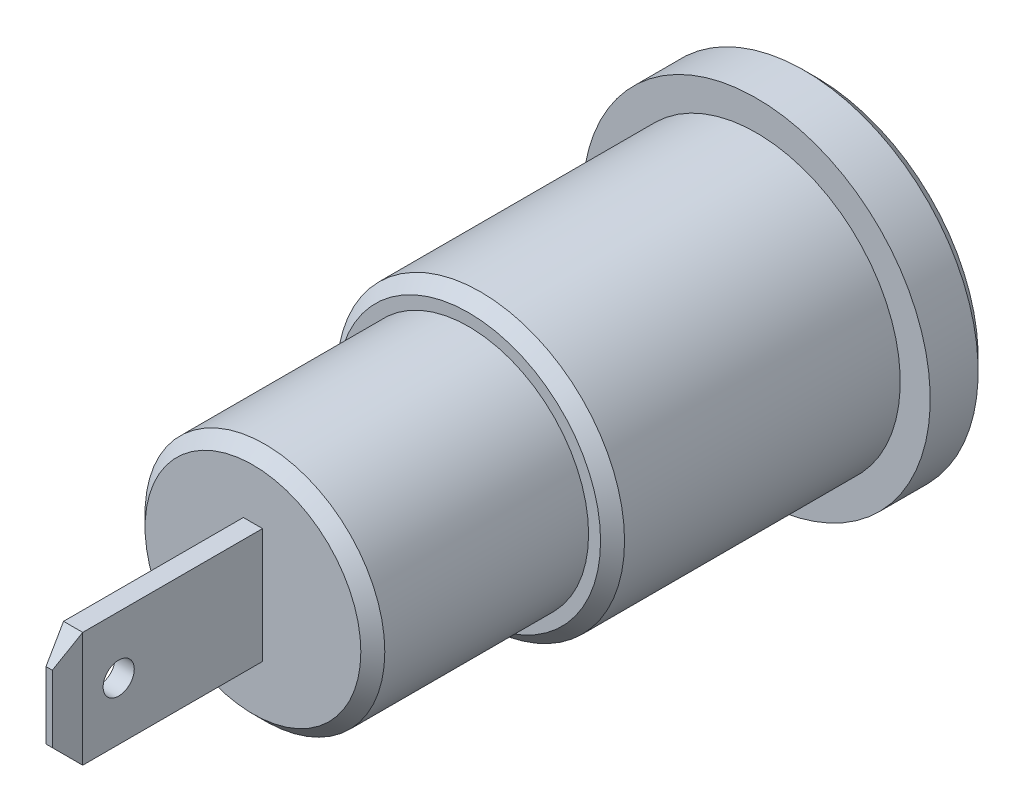
ISO-10303-21;
HEADER;
FILE_DESCRIPTION(('STEP AP214'),'2;1');
FILE_NAME('part.step','',(''),(''),'','','');
FILE_SCHEMA(('AUTOMOTIVE_DESIGN { 1 0 10303 214 1 1 1 1 }'));
ENDSEC;
DATA;
#1=APPLICATION_CONTEXT('core data for automotive mechanical design processes');
#2=APPLICATION_PROTOCOL_DEFINITION('international standard','automotive_design',2000,#1);
#3=PRODUCT_CONTEXT('',#1,'mechanical');
#4=PRODUCT('Part','Part','',(#3));
#5=PRODUCT_RELATED_PRODUCT_CATEGORY('part','',(#4));
#6=PRODUCT_DEFINITION_FORMATION('','',#4);
#7=PRODUCT_DEFINITION_CONTEXT('part definition',#1,'design');
#8=PRODUCT_DEFINITION('design','',#6,#7);
#9=PRODUCT_DEFINITION_SHAPE('','',#8);
#10=(LENGTH_UNIT() NAMED_UNIT(*) SI_UNIT(.MILLI.,.METRE.));
#11=(NAMED_UNIT(*) PLANE_ANGLE_UNIT() SI_UNIT($,.RADIAN.));
#12=(NAMED_UNIT(*) SI_UNIT($,.STERADIAN.) SOLID_ANGLE_UNIT());
#13=UNCERTAINTY_MEASURE_WITH_UNIT(LENGTH_MEASURE(1.E-05),#10,'distance_accuracy_value','');
#14=(GEOMETRIC_REPRESENTATION_CONTEXT(3) GLOBAL_UNCERTAINTY_ASSIGNED_CONTEXT((#13)) GLOBAL_UNIT_ASSIGNED_CONTEXT((#10,
#11,#12)) REPRESENTATION_CONTEXT('',''));
#15=CARTESIAN_POINT('',(0.,0.,0.));
#16=DIRECTION('',(0.,0.,1.));
#17=DIRECTION('',(1.,0.,0.));
#18=AXIS2_PLACEMENT_3D('',#15,#16,#17);
#19=CARTESIAN_POINT('',(0.,0.,21.));
#20=DIRECTION('',(0.,0.,1.));
#21=DIRECTION('',(1.,0.,0.));
#22=AXIS2_PLACEMENT_3D('',#19,#20,#21);
#23=PLANE('',#22);
#24=CARTESIAN_POINT('',(0.,0.,21.));
#25=DIRECTION('',(0.,0.,1.));
#26=DIRECTION('',(1.,0.,0.));
#27=AXIS2_PLACEMENT_3D('',#24,#25,#26);
#28=CIRCLE('',#27,4.5);
#29=CARTESIAN_POINT('',(4.5,0.,21.));
#30=VERTEX_POINT('',#29);
#31=EDGE_CURVE('E170',#30,#30,#28,.T.);
#32=ORIENTED_EDGE('',*,*,#31,.T.);
#33=EDGE_LOOP('',(#32));
#34=FACE_BOUND('',#33,.T.);
#35=DIRECTION('',(1.,0.,0.));
#36=VECTOR('',#35,1.);
#37=CARTESIAN_POINT('',(-0.4,-2.4,21.));
#38=LINE('',#37,#36);
#39=CARTESIAN_POINT('',(-0.4,-2.4,21.));
#40=VERTEX_POINT('',#39);
#41=CARTESIAN_POINT('',(0.4,-2.4,21.));
#42=VERTEX_POINT('',#41);
#43=EDGE_CURVE('E132',#40,#42,#38,.T.);
#44=ORIENTED_EDGE('',*,*,#43,.F.);
#45=DIRECTION('',(0.,1.,0.));
#46=VECTOR('',#45,1.);
#47=CARTESIAN_POINT('',(-0.4,-2.4,21.));
#48=LINE('',#47,#46);
#49=CARTESIAN_POINT('',(-0.4,2.4,21.));
#50=VERTEX_POINT('',#49);
#51=EDGE_CURVE('E98',#40,#50,#48,.T.);
#52=ORIENTED_EDGE('',*,*,#51,.T.);
#53=DIRECTION('',(1.,0.,0.));
#54=VECTOR('',#53,1.);
#55=CARTESIAN_POINT('',(-0.4,2.4,21.));
#56=LINE('',#55,#54);
#57=CARTESIAN_POINT('',(0.4,2.4,21.));
#58=VERTEX_POINT('',#57);
#59=EDGE_CURVE('E92',#50,#58,#56,.T.);
#60=ORIENTED_EDGE('',*,*,#59,.T.);
#61=DIRECTION('',(0.,1.,0.));
#62=VECTOR('',#61,1.);
#63=CARTESIAN_POINT('',(0.4,-2.4,21.));
#64=LINE('',#63,#62);
#65=EDGE_CURVE('E95',#42,#58,#64,.T.);
#66=ORIENTED_EDGE('',*,*,#65,.F.);
#67=EDGE_LOOP('',(#44,#52,#60,#66));
#68=FACE_BOUND('',#67,.T.);
#69=ADVANCED_FACE('F40',(#34,#68),#23,.T.);
#70=CARTESIAN_POINT('',(0.,0.,12.));
#71=DIRECTION('',(0.,0.,1.));
#72=DIRECTION('',(1.,0.,0.));
#73=AXIS2_PLACEMENT_3D('',#70,#71,#72);
#74=PLANE('',#73);
#75=CARTESIAN_POINT('',(0.,0.,12.));
#76=DIRECTION('',(0.,0.,1.));
#77=DIRECTION('',(1.,0.,0.));
#78=AXIS2_PLACEMENT_3D('',#75,#76,#77);
#79=CIRCLE('',#78,5.50000000000001);
#80=CARTESIAN_POINT('',(5.50000000000001,0.,12.));
#81=VERTEX_POINT('',#80);
#82=EDGE_CURVE('E193',#81,#81,#79,.T.);
#83=ORIENTED_EDGE('',*,*,#82,.T.);
#84=EDGE_LOOP('',(#83));
#85=FACE_BOUND('',#84,.T.);
#86=CARTESIAN_POINT('',(0.,0.,12.));
#87=DIRECTION('',(0.,0.,1.));
#88=DIRECTION('',(1.,0.,0.));
#89=AXIS2_PLACEMENT_3D('',#86,#87,#88);
#90=CIRCLE('',#89,5.);
#91=CARTESIAN_POINT('',(5.,0.,12.));
#92=VERTEX_POINT('',#91);
#93=EDGE_CURVE('E167',#92,#92,#90,.T.);
#94=ORIENTED_EDGE('',*,*,#93,.F.);
#95=EDGE_LOOP('',(#94));
#96=FACE_BOUND('',#95,.T.);
#97=ADVANCED_FACE('F242',(#85,#96),#74,.T.);
#98=CARTESIAN_POINT('',(0.,0.,12.));
#99=DIRECTION('',(0.,0.,-1.));
#100=DIRECTION('',(-1.,0.,0.));
#101=AXIS2_PLACEMENT_3D('',#98,#99,#100);
#102=CYLINDRICAL_SURFACE('',#101,6.);
#103=CARTESIAN_POINT('',(0.,0.,11.5));
#104=DIRECTION('',(0.,0.,1.));
#105=DIRECTION('',(1.,0.,0.));
#106=AXIS2_PLACEMENT_3D('',#103,#104,#105);
#107=CIRCLE('',#106,6.);
#108=CARTESIAN_POINT('',(6.,0.,11.5));
#109=VERTEX_POINT('',#108);
#110=EDGE_CURVE('E196',#109,#109,#107,.F.);
#111=ORIENTED_EDGE('',*,*,#110,.T.);
#112=EDGE_LOOP('',(#111));
#113=FACE_BOUND('',#112,.T.);
#114=CARTESIAN_POINT('',(0.,0.,0.));
#115=DIRECTION('',(0.,0.,-1.));
#116=DIRECTION('',(-1.,0.,0.));
#117=AXIS2_PLACEMENT_3D('',#114,#115,#116);
#118=CIRCLE('',#117,6.);
#119=CARTESIAN_POINT('',(-6.,0.,0.));
#120=VERTEX_POINT('',#119);
#121=EDGE_CURVE('E164',#120,#120,#118,.T.);
#122=ORIENTED_EDGE('',*,*,#121,.F.);
#123=EDGE_LOOP('',(#122));
#124=FACE_BOUND('',#123,.T.);
#125=ADVANCED_FACE('F248',(#113,#124),#102,.T.);
#126=CARTESIAN_POINT('',(0.,0.,21.));
#127=DIRECTION('',(0.,0.,-1.));
#128=DIRECTION('',(-1.,0.,0.));
#129=AXIS2_PLACEMENT_3D('',#126,#127,#128);
#130=CYLINDRICAL_SURFACE('',#129,5.);
#131=CARTESIAN_POINT('',(0.,0.,20.5));
#132=DIRECTION('',(0.,0.,1.));
#133=DIRECTION('',(1.,0.,0.));
#134=AXIS2_PLACEMENT_3D('',#131,#132,#133);
#135=CIRCLE('',#134,5.);
#136=CARTESIAN_POINT('',(5.,0.,20.5));
#137=VERTEX_POINT('',#136);
#138=EDGE_CURVE('E177',#137,#137,#135,.F.);
#139=ORIENTED_EDGE('',*,*,#138,.T.);
#140=EDGE_LOOP('',(#139));
#141=FACE_BOUND('',#140,.T.);
#142=ORIENTED_EDGE('',*,*,#93,.T.);
#143=EDGE_LOOP('',(#142));
#144=FACE_BOUND('',#143,.T.);
#145=ADVANCED_FACE('F255',(#141,#144),#130,.T.);
#146=CARTESIAN_POINT('',(0.,0.,0.));
#147=DIRECTION('',(0.,0.,-1.));
#148=DIRECTION('',(-1.,0.,0.));
#149=AXIS2_PLACEMENT_3D('',#146,#147,#148);
#150=PLANE('',#149);
#151=CARTESIAN_POINT('',(0.,0.,0.));
#152=DIRECTION('',(0.,0.,-1.));
#153=DIRECTION('',(-1.,0.,0.));
#154=AXIS2_PLACEMENT_3D('',#151,#152,#153);
#155=CIRCLE('',#154,7.25);
#156=CARTESIAN_POINT('',(-7.25,0.,0.));
#157=VERTEX_POINT('',#156);
#158=EDGE_CURVE('E161',#157,#157,#155,.T.);
#159=ORIENTED_EDGE('',*,*,#158,.F.);
#160=EDGE_LOOP('',(#159));
#161=FACE_BOUND('',#160,.T.);
#162=ORIENTED_EDGE('',*,*,#121,.T.);
#163=EDGE_LOOP('',(#162));
#164=FACE_BOUND('',#163,.T.);
#165=ADVANCED_FACE('F257',(#161,#164),#150,.F.);
#166=CARTESIAN_POINT('',(0.,0.,-2.5));
#167=DIRECTION('',(0.,0.,1.));
#168=DIRECTION('',(1.,0.,0.));
#169=AXIS2_PLACEMENT_3D('',#166,#167,#168);
#170=CYLINDRICAL_SURFACE('',#169,7.25);
#171=CARTESIAN_POINT('',(0.,0.,-2.));
#172=DIRECTION('',(0.,0.,-1.));
#173=DIRECTION('',(-1.,0.,0.));
#174=AXIS2_PLACEMENT_3D('',#171,#172,#173);
#175=CIRCLE('',#174,7.25);
#176=CARTESIAN_POINT('',(-7.25,0.,-2.));
#177=VERTEX_POINT('',#176);
#178=EDGE_CURVE('E190',#177,#177,#175,.F.);
#179=ORIENTED_EDGE('',*,*,#178,.T.);
#180=EDGE_LOOP('',(#179));
#181=FACE_BOUND('',#180,.T.);
#182=ORIENTED_EDGE('',*,*,#158,.T.);
#183=EDGE_LOOP('',(#182));
#184=FACE_BOUND('',#183,.T.);
#185=ADVANCED_FACE('F253',(#181,#184),#170,.T.);
#186=CARTESIAN_POINT('',(0.,0.,-2.5));
#187=DIRECTION('',(0.,0.,-1.));
#188=DIRECTION('',(-1.,0.,0.));
#189=AXIS2_PLACEMENT_3D('',#186,#187,#188);
#190=PLANE('',#189);
#191=CARTESIAN_POINT('',(0.,0.,-2.5));
#192=DIRECTION('',(0.,0.,-1.));
#193=DIRECTION('',(-1.,0.,0.));
#194=AXIS2_PLACEMENT_3D('',#191,#192,#193);
#195=CIRCLE('',#194,4.75);
#196=CARTESIAN_POINT('',(-4.75,0.,-2.5));
#197=VERTEX_POINT('',#196);
#198=EDGE_CURVE('E187',#197,#197,#195,.F.);
#199=ORIENTED_EDGE('',*,*,#198,.T.);
#200=EDGE_LOOP('',(#199));
#201=FACE_BOUND('',#200,.T.);
#202=CARTESIAN_POINT('',(0.,0.,-2.5));
#203=DIRECTION('',(0.,0.,-1.));
#204=DIRECTION('',(-1.,0.,0.));
#205=AXIS2_PLACEMENT_3D('',#202,#203,#204);
#206=CIRCLE('',#205,6.75);
#207=CARTESIAN_POINT('',(-6.75,0.,-2.5));
#208=VERTEX_POINT('',#207);
#209=EDGE_CURVE('E184',#208,#208,#206,.T.);
#210=ORIENTED_EDGE('',*,*,#209,.T.);
#211=EDGE_LOOP('',(#210));
#212=FACE_BOUND('',#211,.T.);
#213=ADVANCED_FACE('F296',(#201,#212),#190,.T.);
#214=CARTESIAN_POINT('',(0.,0.,7.5));
#215=DIRECTION('',(0.,0.,-1.));
#216=DIRECTION('',(-1.,0.,0.));
#217=AXIS2_PLACEMENT_3D('',#214,#215,#216);
#218=CYLINDRICAL_SURFACE('',#217,4.25);
#219=CARTESIAN_POINT('',(0.,0.,-2.));
#220=DIRECTION('',(0.,0.,-1.));
#221=DIRECTION('',(-1.,0.,0.));
#222=AXIS2_PLACEMENT_3D('',#219,#220,#221);
#223=CIRCLE('',#222,4.25);
#224=CARTESIAN_POINT('',(-4.25,0.,-2.));
#225=VERTEX_POINT('',#224);
#226=EDGE_CURVE('E181',#225,#225,#223,.T.);
#227=ORIENTED_EDGE('',*,*,#226,.T.);
#228=EDGE_LOOP('',(#227));
#229=FACE_BOUND('',#228,.T.);
#230=CARTESIAN_POINT('',(0.,0.,7.5));
#231=DIRECTION('',(0.,0.,-1.));
#232=DIRECTION('',(-1.,0.,0.));
#233=AXIS2_PLACEMENT_3D('',#230,#231,#232);
#234=CIRCLE('',#233,4.25);
#235=CARTESIAN_POINT('',(-4.25,0.,7.5));
#236=VERTEX_POINT('',#235);
#237=EDGE_CURVE('E146',#236,#236,#234,.T.);
#238=ORIENTED_EDGE('',*,*,#237,.F.);
#239=EDGE_LOOP('',(#238));
#240=FACE_BOUND('',#239,.T.);
#241=ADVANCED_FACE('F320',(#229,#240),#218,.F.);
#242=CARTESIAN_POINT('',(0.,0.,7.5));
#243=DIRECTION('',(0.,0.,-1.));
#244=DIRECTION('',(-1.,0.,0.));
#245=AXIS2_PLACEMENT_3D('',#242,#243,#244);
#246=PLANE('',#245);
#247=CARTESIAN_POINT('',(0.,0.,7.5));
#248=DIRECTION('',(0.,0.,-1.));
#249=DIRECTION('',(-1.,0.,0.));
#250=AXIS2_PLACEMENT_3D('',#247,#248,#249);
#251=CIRCLE('',#250,2.5);
#252=CARTESIAN_POINT('',(-2.5,0.,7.5));
#253=VERTEX_POINT('',#252);
#254=EDGE_CURVE('E134',#253,#253,#251,.T.);
#255=ORIENTED_EDGE('',*,*,#254,.F.);
#256=EDGE_LOOP('',(#255));
#257=FACE_BOUND('',#256,.T.);
#258=ORIENTED_EDGE('',*,*,#237,.T.);
#259=EDGE_LOOP('',(#258));
#260=FACE_BOUND('',#259,.T.);
#261=ADVANCED_FACE('F350',(#257,#260),#246,.T.);
#262=CARTESIAN_POINT('',(0.,0.,7.5));
#263=DIRECTION('',(0.,0.,-1.));
#264=DIRECTION('',(-1.,0.,0.));
#265=AXIS2_PLACEMENT_3D('',#262,#263,#264);
#266=CYLINDRICAL_SURFACE('',#265,2.5);
#267=CARTESIAN_POINT('',(0.,0.,-2.3));
#268=DIRECTION('',(0.,0.,-1.));
#269=DIRECTION('',(-1.,0.,0.));
#270=AXIS2_PLACEMENT_3D('',#267,#268,#269);
#271=CIRCLE('',#270,2.5);
#272=CARTESIAN_POINT('',(-2.5,0.,-2.3));
#273=VERTEX_POINT('',#272);
#274=EDGE_CURVE('E203',#273,#273,#271,.F.);
#275=ORIENTED_EDGE('',*,*,#274,.T.);
#276=EDGE_LOOP('',(#275));
#277=FACE_BOUND('',#276,.T.);
#278=ORIENTED_EDGE('',*,*,#254,.T.);
#279=EDGE_LOOP('',(#278));
#280=FACE_BOUND('',#279,.T.);
#281=ADVANCED_FACE('F315',(#277,#280),#266,.T.);
#282=CARTESIAN_POINT('',(0.,0.,17.5));
#283=DIRECTION('',(0.,0.,-1.));
#284=DIRECTION('',(-1.,0.,0.));
#285=AXIS2_PLACEMENT_3D('',#282,#283,#284);
#286=PLANE('',#285);
#287=CARTESIAN_POINT('',(0.,0.,17.5));
#288=DIRECTION('',(0.,0.,-1.));
#289=DIRECTION('',(-1.,0.,0.));
#290=AXIS2_PLACEMENT_3D('',#287,#288,#289);
#291=CIRCLE('',#290,2.);
#292=CARTESIAN_POINT('',(-2.,0.,17.5));
#293=VERTEX_POINT('',#292);
#294=EDGE_CURVE('E158',#293,#293,#291,.T.);
#295=ORIENTED_EDGE('',*,*,#294,.T.);
#296=EDGE_LOOP('',(#295));
#297=FACE_BOUND('',#296,.T.);
#298=ADVANCED_FACE('F312',(#297),#286,.T.);
#299=CARTESIAN_POINT('',(0.,0.,17.5));
#300=DIRECTION('',(0.,0.,-1.));
#301=DIRECTION('',(-1.,0.,0.));
#302=AXIS2_PLACEMENT_3D('',#299,#300,#301);
#303=CYLINDRICAL_SURFACE('',#302,2.);
#304=ORIENTED_EDGE('',*,*,#294,.F.);
#305=EDGE_LOOP('',(#304));
#306=FACE_BOUND('',#305,.T.);
#307=CARTESIAN_POINT('',(0.,0.,3.));
#308=DIRECTION('',(0.,0.,-1.));
#309=DIRECTION('',(-1.,0.,0.));
#310=AXIS2_PLACEMENT_3D('',#307,#308,#309);
#311=CIRCLE('',#310,2.);
#312=CARTESIAN_POINT('',(-2.,0.,3.));
#313=VERTEX_POINT('',#312);
#314=EDGE_CURVE('E154',#313,#313,#311,.F.);
#315=ORIENTED_EDGE('',*,*,#314,.F.);
#316=EDGE_LOOP('',(#315));
#317=FACE_BOUND('',#316,.T.);
#318=ADVANCED_FACE('F306',(#306,#317),#303,.F.);
#319=CARTESIAN_POINT('',(0.,0.,3.));
#320=DIRECTION('',(0.,0.,-1.));
#321=DIRECTION('',(-1.,0.,0.));
#322=AXIS2_PLACEMENT_3D('',#319,#320,#321);
#323=PLANE('',#322);
#324=CARTESIAN_POINT('',(0.,0.,3.));
#325=DIRECTION('',(0.,0.,-1.));
#326=DIRECTION('',(-1.,0.,0.));
#327=AXIS2_PLACEMENT_3D('',#324,#325,#326);
#328=CIRCLE('',#327,2.1);
#329=CARTESIAN_POINT('',(-2.1,0.,3.));
#330=VERTEX_POINT('',#329);
#331=EDGE_CURVE('E150',#330,#330,#328,.T.);
#332=ORIENTED_EDGE('',*,*,#331,.T.);
#333=EDGE_LOOP('',(#332));
#334=FACE_BOUND('',#333,.T.);
#335=ORIENTED_EDGE('',*,*,#314,.T.);
#336=EDGE_LOOP('',(#335));
#337=FACE_BOUND('',#336,.T.);
#338=ADVANCED_FACE('F300',(#334,#337),#323,.T.);
#339=CARTESIAN_POINT('',(0.,0.,3.));
#340=DIRECTION('',(0.,0.,-1.));
#341=DIRECTION('',(-1.,0.,0.));
#342=AXIS2_PLACEMENT_3D('',#339,#340,#341);
#343=CYLINDRICAL_SURFACE('',#342,2.1);
#344=ORIENTED_EDGE('',*,*,#331,.F.);
#345=EDGE_LOOP('',(#344));
#346=FACE_BOUND('',#345,.T.);
#347=CARTESIAN_POINT('',(0.,0.,-2.5));
#348=DIRECTION('',(0.,0.,-1.));
#349=DIRECTION('',(-1.,0.,0.));
#350=AXIS2_PLACEMENT_3D('',#347,#348,#349);
#351=CIRCLE('',#350,2.1);
#352=CARTESIAN_POINT('',(-2.1,0.,-2.5));
#353=VERTEX_POINT('',#352);
#354=EDGE_CURVE('E149',#353,#353,#351,.T.);
#355=ORIENTED_EDGE('',*,*,#354,.T.);
#356=EDGE_LOOP('',(#355));
#357=FACE_BOUND('',#356,.T.);
#358=ADVANCED_FACE('F294',(#346,#357),#343,.F.);
#359=CARTESIAN_POINT('',(0.,0.,-2.5));
#360=DIRECTION('',(0.,0.,-1.));
#361=DIRECTION('',(-1.,0.,0.));
#362=AXIS2_PLACEMENT_3D('',#359,#360,#361);
#363=CIRCLE('',#362,2.3);
#364=CARTESIAN_POINT('',(-2.3,0.,-2.5));
#365=VERTEX_POINT('',#364);
#366=EDGE_CURVE('E199',#365,#365,#363,.T.);
#367=ORIENTED_EDGE('',*,*,#366,.T.);
#368=EDGE_LOOP('',(#367));
#369=FACE_BOUND('',#368,.T.);
#370=ORIENTED_EDGE('',*,*,#354,.F.);
#371=EDGE_LOOP('',(#370));
#372=FACE_BOUND('',#371,.T.);
#373=ADVANCED_FACE('F267',(#369,#372),#190,.T.);
#374=CARTESIAN_POINT('',(0.,0.,21.));
#375=DIRECTION('',(0.,0.,-1.));
#376=DIRECTION('',(-1.,0.,0.));
#377=AXIS2_PLACEMENT_3D('',#374,#375,#376);
#378=CONICAL_SURFACE('',#377,4.5,0.785398163397447);
#379=ORIENTED_EDGE('',*,*,#138,.F.);
#380=EDGE_LOOP('',(#379));
#381=FACE_BOUND('',#380,.T.);
#382=ORIENTED_EDGE('',*,*,#31,.F.);
#383=EDGE_LOOP('',(#382));
#384=FACE_BOUND('',#383,.T.);
#385=ADVANCED_FACE('F263',(#381,#384),#378,.T.);
#386=CARTESIAN_POINT('',(0.,0.,-2.));
#387=DIRECTION('',(0.,0.,-1.));
#388=DIRECTION('',(-1.,0.,0.));
#389=AXIS2_PLACEMENT_3D('',#386,#387,#388);
#390=CONICAL_SURFACE('',#389,4.25,0.78539816339745);
#391=ORIENTED_EDGE('',*,*,#198,.F.);
#392=EDGE_LOOP('',(#391));
#393=FACE_BOUND('',#392,.T.);
#394=ORIENTED_EDGE('',*,*,#226,.F.);
#395=EDGE_LOOP('',(#394));
#396=FACE_BOUND('',#395,.T.);
#397=ADVANCED_FACE('F266',(#393,#396),#390,.F.);
#398=CARTESIAN_POINT('',(0.,0.,-2.5));
#399=DIRECTION('',(0.,0.,1.));
#400=DIRECTION('',(1.,0.,0.));
#401=AXIS2_PLACEMENT_3D('',#398,#399,#400);
#402=CONICAL_SURFACE('',#401,6.75,0.78539816339745);
#403=ORIENTED_EDGE('',*,*,#178,.F.);
#404=EDGE_LOOP('',(#403));
#405=FACE_BOUND('',#404,.T.);
#406=ORIENTED_EDGE('',*,*,#209,.F.);
#407=EDGE_LOOP('',(#406));
#408=FACE_BOUND('',#407,.T.);
#409=ADVANCED_FACE('F271',(#405,#408),#402,.T.);
#410=CARTESIAN_POINT('',(0.,0.,12.));
#411=DIRECTION('',(0.,0.,-1.));
#412=DIRECTION('',(-1.,0.,0.));
#413=AXIS2_PLACEMENT_3D('',#410,#411,#412);
#414=CONICAL_SURFACE('',#413,5.50000000000001,0.785398163397447);
#415=ORIENTED_EDGE('',*,*,#110,.F.);
#416=EDGE_LOOP('',(#415));
#417=FACE_BOUND('',#416,.T.);
#418=ORIENTED_EDGE('',*,*,#82,.F.);
#419=EDGE_LOOP('',(#418));
#420=FACE_BOUND('',#419,.T.);
#421=ADVANCED_FACE('F275',(#417,#420),#414,.T.);
#422=CARTESIAN_POINT('',(0.,0.,-2.5));
#423=DIRECTION('',(0.,0.,1.));
#424=DIRECTION('',(1.,0.,0.));
#425=AXIS2_PLACEMENT_3D('',#422,#423,#424);
#426=CONICAL_SURFACE('',#425,2.3,0.785398163397447);
#427=ORIENTED_EDGE('',*,*,#274,.F.);
#428=EDGE_LOOP('',(#427));
#429=FACE_BOUND('',#428,.T.);
#430=ORIENTED_EDGE('',*,*,#366,.F.);
#431=EDGE_LOOP('',(#430));
#432=FACE_BOUND('',#431,.T.);
#433=ADVANCED_FACE('F278',(#429,#432),#426,.T.);
#434=CARTESIAN_POINT('',(-0.4,-2.4,21.));
#435=DIRECTION('',(0.,-1.,0.));
#436=DIRECTION('',(0.,0.,-1.));
#437=AXIS2_PLACEMENT_3D('',#434,#435,#436);
#438=PLANE('',#437);
#439=ORIENTED_EDGE('',*,*,#43,.T.);
#440=DIRECTION('',(0.,0.,-1.));
#441=VECTOR('',#440,1.);
#442=CARTESIAN_POINT('',(0.4,-2.4,21.));
#443=LINE('',#442,#441);
#444=CARTESIAN_POINT('',(0.4,-2.4,28.5));
#445=VERTEX_POINT('',#444);
#446=EDGE_CURVE('E112',#445,#42,#443,.T.);
#447=ORIENTED_EDGE('',*,*,#446,.F.);
#448=DIRECTION('',(1.,0.,0.));
#449=VECTOR('',#448,1.);
#450=CARTESIAN_POINT('',(-0.4,-2.4,28.5));
#451=LINE('',#450,#449);
#452=CARTESIAN_POINT('',(-0.4,-2.4,28.5));
#453=VERTEX_POINT('',#452);
#454=EDGE_CURVE('E135',#453,#445,#451,.T.);
#455=ORIENTED_EDGE('',*,*,#454,.F.);
#456=DIRECTION('',(0.,0.,-1.));
#457=VECTOR('',#456,1.);
#458=CARTESIAN_POINT('',(-0.4,-2.4,21.));
#459=LINE('',#458,#457);
#460=EDGE_CURVE('E103',#453,#40,#459,.T.);
#461=ORIENTED_EDGE('',*,*,#460,.T.);
#462=EDGE_LOOP('',(#439,#447,#455,#461));
#463=FACE_BOUND('',#462,.T.);
#464=ADVANCED_FACE('F281',(#463),#438,.T.);
#465=CARTESIAN_POINT('',(-0.4,-2.4,28.5));
#466=DIRECTION('',(0.,-0.707106781186548,0.707106781186547));
#467=DIRECTION('',(0.,-0.707106781186547,-0.707106781186548));
#468=AXIS2_PLACEMENT_3D('',#465,#466,#467);
#469=PLANE('',#468);
#470=DIRECTION('',(1.,0.,0.));
#471=VECTOR('',#470,1.);
#472=CARTESIAN_POINT('',(-0.4,-1.4,29.5));
#473=LINE('',#472,#471);
#474=CARTESIAN_POINT('',(-0.132050807568875,-1.4,29.5));
#475=VERTEX_POINT('',#474);
#476=CARTESIAN_POINT('',(0.132050807568875,-1.4,29.5));
#477=VERTEX_POINT('',#476);
#478=EDGE_CURVE('E138',#475,#477,#473,.T.);
#479=ORIENTED_EDGE('',*,*,#478,.F.);
#480=DIRECTION('',(-0.186156787897384,-0.694746590606866,-0.694746590606866));
#481=VECTOR('',#480,1.);
#482=CARTESIAN_POINT('',(-0.399999999999996,-2.4,28.5));
#483=LINE('',#482,#481);
#484=EDGE_CURVE('E61',#475,#453,#483,.T.);
#485=ORIENTED_EDGE('',*,*,#484,.T.);
#486=ORIENTED_EDGE('',*,*,#454,.T.);
#487=DIRECTION('',(0.186156787897384,-0.694746590606866,-0.694746590606866));
#488=VECTOR('',#487,1.);
#489=CARTESIAN_POINT('',(0.372276520255779,-2.29653456503198,28.603465434968));
#490=LINE('',#489,#488);
#491=EDGE_CURVE('E209',#445,#477,#490,.F.);
#492=ORIENTED_EDGE('',*,*,#491,.T.);
#493=EDGE_LOOP('',(#479,#485,#486,#492));
#494=FACE_BOUND('',#493,.T.);
#495=ADVANCED_FACE('F228',(#494),#469,.T.);
#496=CARTESIAN_POINT('',(-0.4,-1.4,29.5));
#497=DIRECTION('',(0.,0.,1.));
#498=DIRECTION('',(1.,0.,0.));
#499=AXIS2_PLACEMENT_3D('',#496,#497,#498);
#500=PLANE('',#499);
#501=DIRECTION('',(1.,0.,0.));
#502=VECTOR('',#501,1.);
#503=CARTESIAN_POINT('',(-0.4,1.4,29.5));
#504=LINE('',#503,#502);
#505=CARTESIAN_POINT('',(-0.132050807568875,1.4,29.5));
#506=VERTEX_POINT('',#505);
#507=CARTESIAN_POINT('',(0.132050807568876,1.4,29.5));
#508=VERTEX_POINT('',#507);
#509=EDGE_CURVE('E140',#506,#508,#504,.T.);
#510=ORIENTED_EDGE('',*,*,#509,.F.);
#511=DIRECTION('',(0.,-1.,0.));
#512=VECTOR('',#511,1.);
#513=CARTESIAN_POINT('',(-0.132050807568875,-1.4,29.5));
#514=LINE('',#513,#512);
#515=EDGE_CURVE('E217',#506,#475,#514,.T.);
#516=ORIENTED_EDGE('',*,*,#515,.T.);
#517=ORIENTED_EDGE('',*,*,#478,.T.);
#518=DIRECTION('',(0.,1.,0.));
#519=VECTOR('',#518,1.);
#520=CARTESIAN_POINT('',(0.132050807568875,-1.4,29.5));
#521=LINE('',#520,#519);
#522=EDGE_CURVE('E212',#477,#508,#521,.T.);
#523=ORIENTED_EDGE('',*,*,#522,.T.);
#524=EDGE_LOOP('',(#510,#516,#517,#523));
#525=FACE_BOUND('',#524,.T.);
#526=ADVANCED_FACE('F226',(#525),#500,.T.);
#527=CARTESIAN_POINT('',(-0.4,2.4,28.5));
#528=DIRECTION('',(0.,0.707106781186547,0.707106781186548));
#529=DIRECTION('',(0.,-0.707106781186548,0.707106781186547));
#530=AXIS2_PLACEMENT_3D('',#527,#528,#529);
#531=PLANE('',#530);
#532=DIRECTION('',(1.,0.,0.));
#533=VECTOR('',#532,1.);
#534=CARTESIAN_POINT('',(-0.4,2.4,28.5));
#535=LINE('',#534,#533);
#536=CARTESIAN_POINT('',(-0.4,2.4,28.5));
#537=VERTEX_POINT('',#536);
#538=CARTESIAN_POINT('',(0.4,2.4,28.5));
#539=VERTEX_POINT('',#538);
#540=EDGE_CURVE('E102',#537,#539,#535,.T.);
#541=ORIENTED_EDGE('',*,*,#540,.F.);
#542=DIRECTION('',(0.186156787897384,-0.694746590606866,0.694746590606865));
#543=VECTOR('',#542,1.);
#544=CARTESIAN_POINT('',(-0.399999999999996,2.4,28.5));
#545=LINE('',#544,#543);
#546=EDGE_CURVE('E12',#537,#506,#545,.T.);
#547=ORIENTED_EDGE('',*,*,#546,.T.);
#548=ORIENTED_EDGE('',*,*,#509,.T.);
#549=DIRECTION('',(-0.186156787897384,-0.694746590606866,0.694746590606865));
#550=VECTOR('',#549,1.);
#551=CARTESIAN_POINT('',(0.372276520255779,2.29653456503197,28.603465434968));
#552=LINE('',#551,#550);
#553=EDGE_CURVE('E215',#508,#539,#552,.F.);
#554=ORIENTED_EDGE('',*,*,#553,.T.);
#555=EDGE_LOOP('',(#541,#547,#548,#554));
#556=FACE_BOUND('',#555,.T.);
#557=ADVANCED_FACE('F222',(#556),#531,.T.);
#558=CARTESIAN_POINT('',(-0.4,2.4,21.));
#559=DIRECTION('',(0.,1.,0.));
#560=DIRECTION('',(0.,0.,1.));
#561=AXIS2_PLACEMENT_3D('',#558,#559,#560);
#562=PLANE('',#561);
#563=ORIENTED_EDGE('',*,*,#540,.T.);
#564=DIRECTION('',(0.,0.,1.));
#565=VECTOR('',#564,1.);
#566=CARTESIAN_POINT('',(0.4,2.4,21.));
#567=LINE('',#566,#565);
#568=EDGE_CURVE('E107',#58,#539,#567,.T.);
#569=ORIENTED_EDGE('',*,*,#568,.F.);
#570=ORIENTED_EDGE('',*,*,#59,.F.);
#571=DIRECTION('',(0.,0.,1.));
#572=VECTOR('',#571,1.);
#573=CARTESIAN_POINT('',(-0.4,2.4,21.));
#574=LINE('',#573,#572);
#575=EDGE_CURVE('E128',#50,#537,#574,.T.);
#576=ORIENTED_EDGE('',*,*,#575,.T.);
#577=EDGE_LOOP('',(#563,#569,#570,#576));
#578=FACE_BOUND('',#577,.T.);
#579=ADVANCED_FACE('F108',(#578),#562,.T.);
#580=CARTESIAN_POINT('',(-0.4,0.,0.));
#581=DIRECTION('',(1.,0.,0.));
#582=DIRECTION('',(0.,0.,-1.));
#583=AXIS2_PLACEMENT_3D('',#580,#581,#582);
#584=PLANE('',#583);
#585=CARTESIAN_POINT('',(-0.4,0.,27.));
#586=DIRECTION('',(1.,0.,0.));
#587=DIRECTION('',(0.,0.,-1.));
#588=AXIS2_PLACEMENT_3D('',#585,#586,#587);
#589=CIRCLE('',#588,0.650000000000001);
#590=CARTESIAN_POINT('',(-0.4,0.,26.35));
#591=VERTEX_POINT('',#590);
#592=EDGE_CURVE('E124',#591,#591,#589,.T.);
#593=ORIENTED_EDGE('',*,*,#592,.T.);
#594=EDGE_LOOP('',(#593));
#595=FACE_BOUND('',#594,.T.);
#596=ORIENTED_EDGE('',*,*,#460,.F.);
#597=DIRECTION('',(0.,1.,0.));
#598=VECTOR('',#597,1.);
#599=CARTESIAN_POINT('',(-0.4,1.4,28.5));
#600=LINE('',#599,#598);
#601=EDGE_CURVE('E48',#453,#537,#600,.T.);
#602=ORIENTED_EDGE('',*,*,#601,.T.);
#603=ORIENTED_EDGE('',*,*,#575,.F.);
#604=ORIENTED_EDGE('',*,*,#51,.F.);
#605=EDGE_LOOP('',(#596,#602,#603,#604));
#606=FACE_BOUND('',#605,.T.);
#607=ADVANCED_FACE('F221',(#595,#606),#584,.F.);
#608=CARTESIAN_POINT('',(-0.4,0.,27.));
#609=DIRECTION('',(1.,0.,0.));
#610=DIRECTION('',(0.,0.,-1.));
#611=AXIS2_PLACEMENT_3D('',#608,#609,#610);
#612=CYLINDRICAL_SURFACE('',#611,0.650000000000001);
#613=ORIENTED_EDGE('',*,*,#592,.F.);
#614=EDGE_LOOP('',(#613));
#615=FACE_BOUND('',#614,.T.);
#616=CARTESIAN_POINT('',(0.4,0.,27.));
#617=DIRECTION('',(1.,0.,0.));
#618=DIRECTION('',(0.,0.,-1.));
#619=AXIS2_PLACEMENT_3D('',#616,#617,#618);
#620=CIRCLE('',#619,0.650000000000001);
#621=CARTESIAN_POINT('',(0.4,0.,26.35));
#622=VERTEX_POINT('',#621);
#623=EDGE_CURVE('E118',#622,#622,#620,.T.);
#624=ORIENTED_EDGE('',*,*,#623,.T.);
#625=EDGE_LOOP('',(#624));
#626=FACE_BOUND('',#625,.T.);
#627=ADVANCED_FACE('F238',(#615,#626),#612,.F.);
#628=CARTESIAN_POINT('',(0.4,0.,0.));
#629=DIRECTION('',(1.,0.,0.));
#630=DIRECTION('',(0.,0.,-1.));
#631=AXIS2_PLACEMENT_3D('',#628,#629,#630);
#632=PLANE('',#631);
#633=ORIENTED_EDGE('',*,*,#568,.T.);
#634=DIRECTION('',(0.,-1.,0.));
#635=VECTOR('',#634,1.);
#636=CARTESIAN_POINT('',(0.4,0.,28.5));
#637=LINE('',#636,#635);
#638=EDGE_CURVE('E207',#539,#445,#637,.T.);
#639=ORIENTED_EDGE('',*,*,#638,.T.);
#640=ORIENTED_EDGE('',*,*,#446,.T.);
#641=ORIENTED_EDGE('',*,*,#65,.T.);
#642=EDGE_LOOP('',(#633,#639,#640,#641));
#643=FACE_BOUND('',#642,.T.);
#644=ORIENTED_EDGE('',*,*,#623,.F.);
#645=EDGE_LOOP('',(#644));
#646=FACE_BOUND('',#645,.T.);
#647=ADVANCED_FACE('F115',(#643,#646),#632,.T.);
#648=CARTESIAN_POINT('',(0.4,0.,28.5));
#649=DIRECTION('',(-0.965925826289069,0.,-0.258819045102519));
#650=DIRECTION('',(0.,-1.,0.));
#651=AXIS2_PLACEMENT_3D('',#648,#649,#650);
#652=PLANE('',#651);
#653=ORIENTED_EDGE('',*,*,#553,.F.);
#654=ORIENTED_EDGE('',*,*,#522,.F.);
#655=ORIENTED_EDGE('',*,*,#491,.F.);
#656=ORIENTED_EDGE('',*,*,#638,.F.);
#657=EDGE_LOOP('',(#653,#654,#655,#656));
#658=FACE_BOUND('',#657,.T.);
#659=ADVANCED_FACE('F232',(#658),#652,.F.);
#660=CARTESIAN_POINT('',(-0.132050807568875,-1.4,29.5));
#661=DIRECTION('',(-0.965925826289069,0.,0.258819045102519));
#662=DIRECTION('',(0.,1.,0.));
#663=AXIS2_PLACEMENT_3D('',#660,#661,#662);
#664=PLANE('',#663);
#665=ORIENTED_EDGE('',*,*,#546,.F.);
#666=ORIENTED_EDGE('',*,*,#601,.F.);
#667=ORIENTED_EDGE('',*,*,#484,.F.);
#668=ORIENTED_EDGE('',*,*,#515,.F.);
#669=EDGE_LOOP('',(#665,#666,#667,#668));
#670=FACE_BOUND('',#669,.T.);
#671=ADVANCED_FACE('F42',(#670),#664,.T.);
#672=CLOSED_SHELL('',(#69,#97,#125,#145,#165,#185,#213,#241,#261,#281,#298,#318,#338,#358,#373,
#385,#397,#409,#421,#433,#464,#495,#526,#557,#579,#607,#627,#647,#659,#671));
#673=MANIFOLD_SOLID_BREP('B2',#672);
#674=ADVANCED_BREP_SHAPE_REPRESENTATION('',(#18,#673),#14);
#675=SHAPE_DEFINITION_REPRESENTATION(#9,#674);
ENDSEC;
END-ISO-10303-21;
